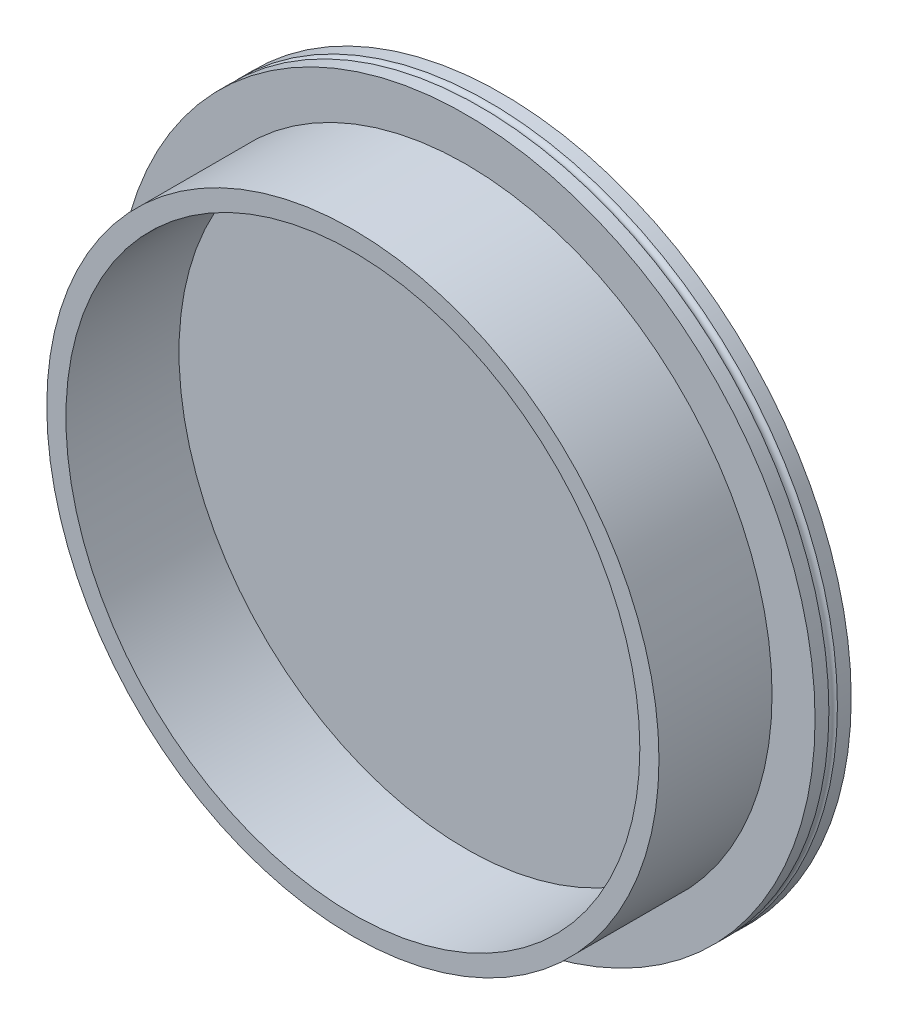
ISO-10303-21;
HEADER;
FILE_DESCRIPTION(('STEP AP214'),'2;1');
FILE_NAME('part.step','',(''),(''),'','','');
FILE_SCHEMA(('AUTOMOTIVE_DESIGN { 1 0 10303 214 1 1 1 1 }'));
ENDSEC;
DATA;
#1=APPLICATION_CONTEXT('core data for automotive mechanical design processes');
#2=APPLICATION_PROTOCOL_DEFINITION('international standard','automotive_design',2000,#1);
#3=PRODUCT_CONTEXT('',#1,'mechanical');
#4=PRODUCT('Part','Part','',(#3));
#5=PRODUCT_RELATED_PRODUCT_CATEGORY('part','',(#4));
#6=PRODUCT_DEFINITION_FORMATION('','',#4);
#7=PRODUCT_DEFINITION_CONTEXT('part definition',#1,'design');
#8=PRODUCT_DEFINITION('design','',#6,#7);
#9=PRODUCT_DEFINITION_SHAPE('','',#8);
#10=(LENGTH_UNIT() NAMED_UNIT(*) SI_UNIT(.MILLI.,.METRE.));
#11=(NAMED_UNIT(*) PLANE_ANGLE_UNIT() SI_UNIT($,.RADIAN.));
#12=(NAMED_UNIT(*) SI_UNIT($,.STERADIAN.) SOLID_ANGLE_UNIT());
#13=UNCERTAINTY_MEASURE_WITH_UNIT(LENGTH_MEASURE(1.E-05),#10,'distance_accuracy_value','');
#14=(GEOMETRIC_REPRESENTATION_CONTEXT(3) GLOBAL_UNCERTAINTY_ASSIGNED_CONTEXT((#13)) GLOBAL_UNIT_ASSIGNED_CONTEXT((#10,
#11,#12)) REPRESENTATION_CONTEXT('',''));
#15=CARTESIAN_POINT('',(0.,0.,0.));
#16=DIRECTION('',(0.,0.,1.));
#17=DIRECTION('',(1.,0.,0.));
#18=AXIS2_PLACEMENT_3D('',#15,#16,#17);
#19=CARTESIAN_POINT('',(0.,95.25,12.));
#20=DIRECTION('',(0.,0.,-1.));
#21=DIRECTION('',(-1.,0.,0.));
#22=AXIS2_PLACEMENT_3D('',#19,#20,#21);
#23=PLANE('',#22);
#24=CARTESIAN_POINT('',(0.,0.,12.));
#25=DIRECTION('',(0.,0.,1.));
#26=DIRECTION('',(1.,0.,0.));
#27=AXIS2_PLACEMENT_3D('',#24,#25,#26);
#28=CIRCLE('',#27,95.25);
#29=CARTESIAN_POINT('',(95.25,0.,12.));
#30=VERTEX_POINT('',#29);
#31=EDGE_CURVE('E71',#30,#30,#28,.T.);
#32=ORIENTED_EDGE('',*,*,#31,.T.);
#33=EDGE_LOOP('',(#32));
#34=FACE_BOUND('',#33,.T.);
#35=ADVANCED_FACE('F31',(#34),#23,.F.);
#36=CARTESIAN_POINT('',(0.,107.374999974,0.));
#37=DIRECTION('',(0.,0.,1.));
#38=DIRECTION('',(1.,0.,0.));
#39=AXIS2_PLACEMENT_3D('',#36,#37,#38);
#40=PLANE('',#39);
#41=CARTESIAN_POINT('',(0.,0.,0.));
#42=DIRECTION('',(0.,0.,1.));
#43=DIRECTION('',(1.,0.,0.));
#44=AXIS2_PLACEMENT_3D('',#41,#42,#43);
#45=CIRCLE('',#44,107.374999974);
#46=CARTESIAN_POINT('',(107.374999974,0.,0.));
#47=VERTEX_POINT('',#46);
#48=EDGE_CURVE('E10',#47,#47,#45,.T.);
#49=ORIENTED_EDGE('',*,*,#48,.F.);
#50=EDGE_LOOP('',(#49));
#51=FACE_BOUND('',#50,.T.);
#52=ADVANCED_FACE('F137',(#51),#40,.F.);
#53=CARTESIAN_POINT('',(0.,0.,12.));
#54=DIRECTION('',(0.,0.,1.));
#55=DIRECTION('',(1.,0.,0.));
#56=AXIS2_PLACEMENT_3D('',#53,#54,#55);
#57=CYLINDRICAL_SURFACE('',#56,107.374999974);
#58=CARTESIAN_POINT('',(0.,0.,2.00000000000001));
#59=DIRECTION('',(0.,0.,1.));
#60=DIRECTION('',(1.,0.,0.));
#61=AXIS2_PLACEMENT_3D('',#58,#59,#60);
#62=CIRCLE('',#61,107.374999974);
#63=CARTESIAN_POINT('',(107.374999974,0.,2.00000000000001));
#64=VERTEX_POINT('',#63);
#65=EDGE_CURVE('E37',#64,#64,#62,.T.);
#66=ORIENTED_EDGE('',*,*,#65,.F.);
#67=EDGE_LOOP('',(#66));
#68=FACE_BOUND('',#67,.T.);
#69=ORIENTED_EDGE('',*,*,#48,.T.);
#70=EDGE_LOOP('',(#69));
#71=FACE_BOUND('',#70,.T.);
#72=ADVANCED_FACE('F132',(#68,#71),#57,.T.);
#73=CARTESIAN_POINT('',(0.,113.374999974,2.00000000000001));
#74=DIRECTION('',(0.,0.,1.));
#75=DIRECTION('',(1.,0.,0.));
#76=AXIS2_PLACEMENT_3D('',#73,#74,#75);
#77=PLANE('',#76);
#78=CARTESIAN_POINT('',(0.,0.,2.00000000000001));
#79=DIRECTION('',(0.,0.,1.));
#80=DIRECTION('',(1.,0.,0.));
#81=AXIS2_PLACEMENT_3D('',#78,#79,#80);
#82=CIRCLE('',#81,113.374999974);
#83=CARTESIAN_POINT('',(113.374999974,0.,2.00000000000001));
#84=VERTEX_POINT('',#83);
#85=EDGE_CURVE('E41',#84,#84,#82,.T.);
#86=ORIENTED_EDGE('',*,*,#85,.F.);
#87=EDGE_LOOP('',(#86));
#88=FACE_BOUND('',#87,.T.);
#89=ORIENTED_EDGE('',*,*,#65,.T.);
#90=EDGE_LOOP('',(#89));
#91=FACE_BOUND('',#90,.T.);
#92=ADVANCED_FACE('F127',(#88,#91),#77,.F.);
#93=CARTESIAN_POINT('',(0.,0.,12.));
#94=DIRECTION('',(0.,0.,1.));
#95=DIRECTION('',(1.,0.,0.));
#96=AXIS2_PLACEMENT_3D('',#93,#94,#95);
#97=CYLINDRICAL_SURFACE('',#96,113.374999974);
#98=CARTESIAN_POINT('',(0.,0.,0.));
#99=DIRECTION('',(0.,0.,1.));
#100=DIRECTION('',(1.,0.,0.));
#101=AXIS2_PLACEMENT_3D('',#98,#99,#100);
#102=CIRCLE('',#101,113.374999974);
#103=CARTESIAN_POINT('',(113.374999974,0.,0.));
#104=VERTEX_POINT('',#103);
#105=EDGE_CURVE('E45',#104,#104,#102,.T.);
#106=ORIENTED_EDGE('',*,*,#105,.F.);
#107=EDGE_LOOP('',(#106));
#108=FACE_BOUND('',#107,.T.);
#109=ORIENTED_EDGE('',*,*,#85,.T.);
#110=EDGE_LOOP('',(#109));
#111=FACE_BOUND('',#110,.T.);
#112=ADVANCED_FACE('F121',(#108,#111),#97,.F.);
#113=CARTESIAN_POINT('',(0.,115.874999992,0.));
#114=DIRECTION('',(0.,0.,1.));
#115=DIRECTION('',(1.,0.,0.));
#116=AXIS2_PLACEMENT_3D('',#113,#114,#115);
#117=PLANE('',#116);
#118=CARTESIAN_POINT('',(0.,0.,0.));
#119=DIRECTION('',(0.,0.,1.));
#120=DIRECTION('',(1.,0.,0.));
#121=AXIS2_PLACEMENT_3D('',#118,#119,#120);
#122=CIRCLE('',#121,115.874999992);
#123=CARTESIAN_POINT('',(115.874999992,0.,0.));
#124=VERTEX_POINT('',#123);
#125=EDGE_CURVE('E50',#124,#124,#122,.T.);
#126=ORIENTED_EDGE('',*,*,#125,.F.);
#127=EDGE_LOOP('',(#126));
#128=FACE_BOUND('',#127,.T.);
#129=ORIENTED_EDGE('',*,*,#105,.T.);
#130=EDGE_LOOP('',(#129));
#131=FACE_BOUND('',#130,.T.);
#132=ADVANCED_FACE('F115',(#128,#131),#117,.F.);
#133=CARTESIAN_POINT('',(0.,0.,12.));
#134=DIRECTION('',(0.,0.,1.));
#135=DIRECTION('',(1.,0.,0.));
#136=AXIS2_PLACEMENT_3D('',#133,#134,#135);
#137=CYLINDRICAL_SURFACE('',#136,115.874999992);
#138=CARTESIAN_POINT('',(0.,0.,4.58578643762691));
#139=DIRECTION('',(0.,0.,1.));
#140=DIRECTION('',(1.,0.,0.));
#141=AXIS2_PLACEMENT_3D('',#138,#139,#140);
#142=CIRCLE('',#141,115.874999992);
#143=CARTESIAN_POINT('',(115.874999992,0.,4.58578643762691));
#144=VERTEX_POINT('',#143);
#145=EDGE_CURVE('E53',#144,#144,#142,.T.);
#146=ORIENTED_EDGE('',*,*,#145,.F.);
#147=EDGE_LOOP('',(#146));
#148=FACE_BOUND('',#147,.T.);
#149=ORIENTED_EDGE('',*,*,#125,.T.);
#150=EDGE_LOOP('',(#149));
#151=FACE_BOUND('',#150,.T.);
#152=ADVANCED_FACE('F109',(#148,#151),#137,.T.);
#153=CARTESIAN_POINT('',(0.,0.,6.00000000000001));
#154=DIRECTION('',(0.,0.,1.));
#155=DIRECTION('',(1.,0.,0.));
#156=AXIS2_PLACEMENT_3D('',#153,#154,#155);
#157=TOROIDAL_SURFACE('',#156,116.374999992,1.5);
#158=CARTESIAN_POINT('',(0.,0.,7.4142135623731));
#159=DIRECTION('',(0.,0.,1.));
#160=DIRECTION('',(1.,0.,0.));
#161=AXIS2_PLACEMENT_3D('',#158,#159,#160);
#162=CIRCLE('',#161,115.874999992);
#163=CARTESIAN_POINT('',(115.874999992,0.,7.4142135623731));
#164=VERTEX_POINT('',#163);
#165=EDGE_CURVE('E56',#164,#164,#162,.T.);
#166=ORIENTED_EDGE('',*,*,#165,.F.);
#167=EDGE_LOOP('',(#166));
#168=FACE_BOUND('',#167,.T.);
#169=ORIENTED_EDGE('',*,*,#145,.T.);
#170=EDGE_LOOP('',(#169));
#171=FACE_BOUND('',#170,.T.);
#172=ADVANCED_FACE('F103',(#168,#171),#157,.F.);
#173=CARTESIAN_POINT('',(0.,0.,12.));
#174=DIRECTION('',(0.,0.,1.));
#175=DIRECTION('',(1.,0.,0.));
#176=AXIS2_PLACEMENT_3D('',#173,#174,#175);
#177=CYLINDRICAL_SURFACE('',#176,115.874999992);
#178=CARTESIAN_POINT('',(0.,0.,12.));
#179=DIRECTION('',(0.,0.,1.));
#180=DIRECTION('',(1.,0.,0.));
#181=AXIS2_PLACEMENT_3D('',#178,#179,#180);
#182=CIRCLE('',#181,115.874999992);
#183=CARTESIAN_POINT('',(115.874999992,0.,12.));
#184=VERTEX_POINT('',#183);
#185=EDGE_CURVE('E59',#184,#184,#182,.T.);
#186=ORIENTED_EDGE('',*,*,#185,.F.);
#187=EDGE_LOOP('',(#186));
#188=FACE_BOUND('',#187,.T.);
#189=ORIENTED_EDGE('',*,*,#165,.T.);
#190=EDGE_LOOP('',(#189));
#191=FACE_BOUND('',#190,.T.);
#192=ADVANCED_FACE('F97',(#188,#191),#177,.T.);
#193=CARTESIAN_POINT('',(0.,101.6,12.));
#194=DIRECTION('',(0.,0.,-1.));
#195=DIRECTION('',(-1.,0.,0.));
#196=AXIS2_PLACEMENT_3D('',#193,#194,#195);
#197=PLANE('',#196);
#198=CARTESIAN_POINT('',(0.,0.,12.));
#199=DIRECTION('',(0.,0.,1.));
#200=DIRECTION('',(1.,0.,0.));
#201=AXIS2_PLACEMENT_3D('',#198,#199,#200);
#202=CIRCLE('',#201,101.6);
#203=CARTESIAN_POINT('',(101.6,0.,12.));
#204=VERTEX_POINT('',#203);
#205=EDGE_CURVE('E62',#204,#204,#202,.T.);
#206=ORIENTED_EDGE('',*,*,#205,.F.);
#207=EDGE_LOOP('',(#206));
#208=FACE_BOUND('',#207,.T.);
#209=ORIENTED_EDGE('',*,*,#185,.T.);
#210=EDGE_LOOP('',(#209));
#211=FACE_BOUND('',#210,.T.);
#212=ADVANCED_FACE('F91',(#208,#211),#197,.F.);
#213=CARTESIAN_POINT('',(0.,0.,12.));
#214=DIRECTION('',(0.,0.,1.));
#215=DIRECTION('',(1.,0.,0.));
#216=AXIS2_PLACEMENT_3D('',#213,#214,#215);
#217=CYLINDRICAL_SURFACE('',#216,101.6);
#218=CARTESIAN_POINT('',(0.,0.,49.5384902011011));
#219=DIRECTION('',(0.,0.,1.));
#220=DIRECTION('',(1.,0.,0.));
#221=AXIS2_PLACEMENT_3D('',#218,#219,#220);
#222=CIRCLE('',#221,101.6);
#223=CARTESIAN_POINT('',(101.6,0.,49.5384902011011));
#224=VERTEX_POINT('',#223);
#225=EDGE_CURVE('E65',#224,#224,#222,.T.);
#226=ORIENTED_EDGE('',*,*,#225,.F.);
#227=EDGE_LOOP('',(#226));
#228=FACE_BOUND('',#227,.T.);
#229=ORIENTED_EDGE('',*,*,#205,.T.);
#230=EDGE_LOOP('',(#229));
#231=FACE_BOUND('',#230,.T.);
#232=ADVANCED_FACE('F85',(#228,#231),#217,.T.);
#233=CARTESIAN_POINT('',(0.,101.6,49.5384902011011));
#234=DIRECTION('',(0.,0.,-1.));
#235=DIRECTION('',(-1.,0.,0.));
#236=AXIS2_PLACEMENT_3D('',#233,#234,#235);
#237=PLANE('',#236);
#238=CARTESIAN_POINT('',(0.,0.,49.5384902011011));
#239=DIRECTION('',(0.,0.,1.));
#240=DIRECTION('',(1.,0.,0.));
#241=AXIS2_PLACEMENT_3D('',#238,#239,#240);
#242=CIRCLE('',#241,95.25);
#243=CARTESIAN_POINT('',(95.25,0.,49.5384902011011));
#244=VERTEX_POINT('',#243);
#245=EDGE_CURVE('E68',#244,#244,#242,.T.);
#246=ORIENTED_EDGE('',*,*,#245,.F.);
#247=EDGE_LOOP('',(#246));
#248=FACE_BOUND('',#247,.T.);
#249=ORIENTED_EDGE('',*,*,#225,.T.);
#250=EDGE_LOOP('',(#249));
#251=FACE_BOUND('',#250,.T.);
#252=ADVANCED_FACE('F79',(#248,#251),#237,.F.);
#253=CARTESIAN_POINT('',(0.,0.,12.));
#254=DIRECTION('',(0.,0.,1.));
#255=DIRECTION('',(1.,0.,0.));
#256=AXIS2_PLACEMENT_3D('',#253,#254,#255);
#257=CYLINDRICAL_SURFACE('',#256,95.25);
#258=ORIENTED_EDGE('',*,*,#31,.F.);
#259=EDGE_LOOP('',(#258));
#260=FACE_BOUND('',#259,.T.);
#261=ORIENTED_EDGE('',*,*,#245,.T.);
#262=EDGE_LOOP('',(#261));
#263=FACE_BOUND('',#262,.T.);
#264=ADVANCED_FACE('F76',(#260,#263),#257,.F.);
#265=CLOSED_SHELL('',(#35,#52,#72,#92,#112,#132,#152,#172,#192,#212,#232,#252,#264));
#266=MANIFOLD_SOLID_BREP('B2',#265);
#267=ADVANCED_BREP_SHAPE_REPRESENTATION('',(#18,#266),#14);
#268=SHAPE_DEFINITION_REPRESENTATION(#9,#267);
ENDSEC;
END-ISO-10303-21;
